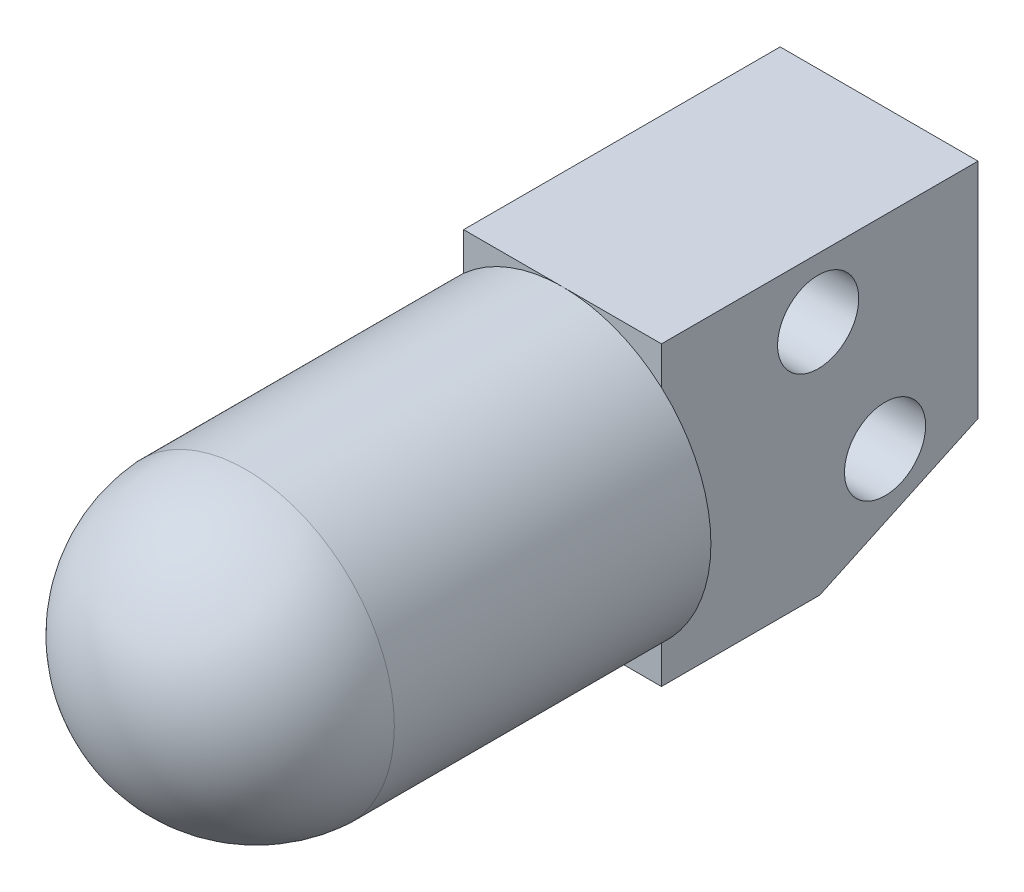
ISO-10303-21;
HEADER;
FILE_DESCRIPTION(('STEP AP214'),'2;1');
FILE_NAME('part.step','',(''),(''),'','','');
FILE_SCHEMA(('AUTOMOTIVE_DESIGN { 1 0 10303 214 1 1 1 1 }'));
ENDSEC;
DATA;
#1=APPLICATION_CONTEXT('core data for automotive mechanical design processes');
#2=APPLICATION_PROTOCOL_DEFINITION('international standard','automotive_design',2000,#1);
#3=PRODUCT_CONTEXT('',#1,'mechanical');
#4=PRODUCT('Part','Part','',(#3));
#5=PRODUCT_RELATED_PRODUCT_CATEGORY('part','',(#4));
#6=PRODUCT_DEFINITION_FORMATION('','',#4);
#7=PRODUCT_DEFINITION_CONTEXT('part definition',#1,'design');
#8=PRODUCT_DEFINITION('design','',#6,#7);
#9=PRODUCT_DEFINITION_SHAPE('','',#8);
#10=(LENGTH_UNIT() NAMED_UNIT(*) SI_UNIT(.MILLI.,.METRE.));
#11=(NAMED_UNIT(*) PLANE_ANGLE_UNIT() SI_UNIT($,.RADIAN.));
#12=(NAMED_UNIT(*) SI_UNIT($,.STERADIAN.) SOLID_ANGLE_UNIT());
#13=UNCERTAINTY_MEASURE_WITH_UNIT(LENGTH_MEASURE(1.E-05),#10,'distance_accuracy_value','');
#14=(GEOMETRIC_REPRESENTATION_CONTEXT(3) GLOBAL_UNCERTAINTY_ASSIGNED_CONTEXT((#13)) GLOBAL_UNIT_ASSIGNED_CONTEXT((#10,
#11,#12)) REPRESENTATION_CONTEXT('',''));
#15=CARTESIAN_POINT('',(0.,0.,0.));
#16=DIRECTION('',(0.,0.,1.));
#17=DIRECTION('',(1.,0.,0.));
#18=AXIS2_PLACEMENT_3D('',#15,#16,#17);
#19=CARTESIAN_POINT('',(0.,0.,0.));
#20=DIRECTION('',(0.,0.,1.));
#21=DIRECTION('',(1.,0.,0.));
#22=AXIS2_PLACEMENT_3D('',#19,#20,#21);
#23=PLANE('',#22);
#24=DIRECTION('',(0.,1.,0.));
#25=VECTOR('',#24,1.);
#26=CARTESIAN_POINT('',(-5.,-7.5,0.));
#27=LINE('',#26,#25);
#28=CARTESIAN_POINT('',(-5.,-5.59016994374947,0.));
#29=VERTEX_POINT('',#28);
#30=CARTESIAN_POINT('',(-5.,5.59016994374947,0.));
#31=VERTEX_POINT('',#30);
#32=EDGE_CURVE('E151',#29,#31,#27,.T.);
#33=ORIENTED_EDGE('',*,*,#32,.F.);
#34=CARTESIAN_POINT('',(0.,0.,0.));
#35=DIRECTION('',(0.,0.,1.));
#36=DIRECTION('',(1.,0.,0.));
#37=AXIS2_PLACEMENT_3D('',#34,#35,#36);
#38=CIRCLE('',#37,7.5);
#39=EDGE_CURVE('E197',#31,#29,#38,.T.);
#40=ORIENTED_EDGE('',*,*,#39,.F.);
#41=EDGE_LOOP('',(#33,#40));
#42=FACE_BOUND('',#41,.T.);
#43=ADVANCED_FACE('F43',(#42),#23,.F.);
#44=DIRECTION('',(0.,-1.,0.));
#45=VECTOR('',#44,1.);
#46=CARTESIAN_POINT('',(5.,-7.5,0.));
#47=LINE('',#46,#45);
#48=CARTESIAN_POINT('',(5.,5.59016994374948,0.));
#49=VERTEX_POINT('',#48);
#50=CARTESIAN_POINT('',(5.,-5.59016994374948,0.));
#51=VERTEX_POINT('',#50);
#52=EDGE_CURVE('E149',#49,#51,#47,.T.);
#53=ORIENTED_EDGE('',*,*,#52,.F.);
#54=EDGE_CURVE('E135',#51,#49,#38,.T.);
#55=ORIENTED_EDGE('',*,*,#54,.F.);
#56=EDGE_LOOP('',(#53,#55));
#57=FACE_BOUND('',#56,.T.);
#58=ADVANCED_FACE('F206',(#57),#23,.F.);
#59=CARTESIAN_POINT('',(0.,0.,16.));
#60=DIRECTION('',(0.,0.,-1.));
#61=DIRECTION('',(-1.,0.,0.));
#62=AXIS2_PLACEMENT_3D('',#59,#60,#61);
#63=CYLINDRICAL_SURFACE('',#62,7.5);
#64=CARTESIAN_POINT('',(0.,0.,16.));
#65=DIRECTION('',(0.,0.,1.));
#66=DIRECTION('',(1.,0.,0.));
#67=AXIS2_PLACEMENT_3D('',#64,#65,#66);
#68=CIRCLE('',#67,7.5);
#69=CARTESIAN_POINT('',(7.5,0.,16.));
#70=VERTEX_POINT('',#69);
#71=EDGE_CURVE('E145',#70,#70,#68,.T.);
#72=ORIENTED_EDGE('',*,*,#71,.F.);
#73=EDGE_LOOP('',(#72));
#74=FACE_BOUND('',#73,.T.);
#75=CARTESIAN_POINT('',(0.,7.5,0.));
#76=VERTEX_POINT('',#75);
#77=EDGE_CURVE('E140',#49,#76,#38,.T.);
#78=ORIENTED_EDGE('',*,*,#77,.T.);
#79=EDGE_CURVE('E146',#76,#31,#38,.T.);
#80=ORIENTED_EDGE('',*,*,#79,.T.);
#81=ORIENTED_EDGE('',*,*,#39,.T.);
#82=CARTESIAN_POINT('',(0.,-7.5,0.));
#83=VERTEX_POINT('',#82);
#84=EDGE_CURVE('E198',#29,#83,#38,.T.);
#85=ORIENTED_EDGE('',*,*,#84,.T.);
#86=EDGE_CURVE('E138',#83,#51,#38,.T.);
#87=ORIENTED_EDGE('',*,*,#86,.T.);
#88=ORIENTED_EDGE('',*,*,#54,.T.);
#89=EDGE_LOOP('',(#78,#80,#81,#85,#87,#88));
#90=FACE_BOUND('',#89,.T.);
#91=ADVANCED_FACE('F192',(#74,#90),#63,.T.);
#92=CARTESIAN_POINT('',(0.,0.,15.4821428571429));
#93=DIRECTION('',(0.,0.,1.));
#94=DIRECTION('',(1.,0.,0.));
#95=AXIS2_PLACEMENT_3D('',#92,#93,#94);
#96=SPHERICAL_SURFACE('',#95,7.51785714285714);
#97=ORIENTED_EDGE('',*,*,#71,.T.);
#98=EDGE_LOOP('',(#97));
#99=FACE_BOUND('',#98,.T.);
#100=ADVANCED_FACE('F231',(#99),#96,.T.);
#101=CARTESIAN_POINT('',(0.,0.,0.));
#102=DIRECTION('',(0.,0.,1.));
#103=DIRECTION('',(1.,0.,0.));
#104=AXIS2_PLACEMENT_3D('',#101,#102,#103);
#105=PLANE('',#104);
#106=ORIENTED_EDGE('',*,*,#77,.F.);
#107=CARTESIAN_POINT('',(5.,7.5,0.));
#108=VERTEX_POINT('',#107);
#109=EDGE_CURVE('E157',#108,#49,#47,.T.);
#110=ORIENTED_EDGE('',*,*,#109,.F.);
#111=DIRECTION('',(1.,0.,0.));
#112=VECTOR('',#111,1.);
#113=CARTESIAN_POINT('',(5.,7.5,0.));
#114=LINE('',#113,#112);
#115=EDGE_CURVE('E161',#76,#108,#114,.T.);
#116=ORIENTED_EDGE('',*,*,#115,.F.);
#117=EDGE_LOOP('',(#106,#110,#116));
#118=FACE_BOUND('',#117,.T.);
#119=ADVANCED_FACE('F188',(#118),#105,.T.);
#120=ORIENTED_EDGE('',*,*,#79,.F.);
#121=CARTESIAN_POINT('',(-5.,7.5,0.));
#122=VERTEX_POINT('',#121);
#123=EDGE_CURVE('E180',#122,#76,#114,.T.);
#124=ORIENTED_EDGE('',*,*,#123,.F.);
#125=EDGE_CURVE('E132',#31,#122,#27,.T.);
#126=ORIENTED_EDGE('',*,*,#125,.F.);
#127=EDGE_LOOP('',(#120,#124,#126));
#128=FACE_BOUND('',#127,.T.);
#129=ADVANCED_FACE('F196',(#128),#105,.T.);
#130=ORIENTED_EDGE('',*,*,#84,.F.);
#131=CARTESIAN_POINT('',(-5.,-7.5,0.));
#132=VERTEX_POINT('',#131);
#133=EDGE_CURVE('E153',#132,#29,#27,.T.);
#134=ORIENTED_EDGE('',*,*,#133,.F.);
#135=DIRECTION('',(-1.,0.,0.));
#136=VECTOR('',#135,1.);
#137=CARTESIAN_POINT('',(5.,-7.5,0.));
#138=LINE('',#137,#136);
#139=EDGE_CURVE('E178',#83,#132,#138,.T.);
#140=ORIENTED_EDGE('',*,*,#139,.F.);
#141=EDGE_LOOP('',(#130,#134,#140));
#142=FACE_BOUND('',#141,.T.);
#143=ADVANCED_FACE('F243',(#142),#105,.T.);
#144=ORIENTED_EDGE('',*,*,#86,.F.);
#145=CARTESIAN_POINT('',(5.,-7.5,0.));
#146=VERTEX_POINT('',#145);
#147=EDGE_CURVE('E116',#146,#83,#138,.T.);
#148=ORIENTED_EDGE('',*,*,#147,.F.);
#149=EDGE_CURVE('E158',#51,#146,#47,.T.);
#150=ORIENTED_EDGE('',*,*,#149,.F.);
#151=EDGE_LOOP('',(#144,#148,#150));
#152=FACE_BOUND('',#151,.T.);
#153=ADVANCED_FACE('F207',(#152),#105,.T.);
#154=CARTESIAN_POINT('',(-5.,-7.5,-16.));
#155=DIRECTION('',(1.,0.,0.));
#156=DIRECTION('',(0.,0.,-1.));
#157=AXIS2_PLACEMENT_3D('',#154,#155,#156);
#158=PLANE('',#157);
#159=CARTESIAN_POINT('',(-5.,4.5,-7.92119769695235));
#160=DIRECTION('',(1.,0.,0.));
#161=DIRECTION('',(0.,0.,-1.));
#162=AXIS2_PLACEMENT_3D('',#159,#160,#161);
#163=CIRCLE('',#162,2.05);
#164=CARTESIAN_POINT('',(-5.,4.5,-9.97119769695235));
#165=VERTEX_POINT('',#164);
#166=EDGE_CURVE('E170',#165,#165,#163,.T.);
#167=ORIENTED_EDGE('',*,*,#166,.T.);
#168=EDGE_LOOP('',(#167));
#169=FACE_BOUND('',#168,.T.);
#170=CARTESIAN_POINT('',(-5.,-2.75046229629318,-11.302143790878));
#171=DIRECTION('',(1.,0.,0.));
#172=DIRECTION('',(0.,0.,-1.));
#173=AXIS2_PLACEMENT_3D('',#170,#171,#172);
#174=CIRCLE('',#173,2.05);
#175=CARTESIAN_POINT('',(-5.,-2.75046229629318,-13.352143790878));
#176=VERTEX_POINT('',#175);
#177=EDGE_CURVE('E162',#176,#176,#174,.T.);
#178=ORIENTED_EDGE('',*,*,#177,.T.);
#179=EDGE_LOOP('',(#178));
#180=FACE_BOUND('',#179,.T.);
#181=DIRECTION('',(0.,1.,0.));
#182=VECTOR('',#181,1.);
#183=CARTESIAN_POINT('',(-5.,-7.5,-16.));
#184=LINE('',#183,#182);
#185=CARTESIAN_POINT('',(-5.,-3.76953873476001,-16.));
#186=VERTEX_POINT('',#185);
#187=CARTESIAN_POINT('',(-5.,7.5,-16.));
#188=VERTEX_POINT('',#187);
#189=EDGE_CURVE('E106',#186,#188,#184,.T.);
#190=ORIENTED_EDGE('',*,*,#189,.F.);
#191=DIRECTION('',(0.,0.422618261740698,-0.906307787036651));
#192=VECTOR('',#191,1.);
#193=CARTESIAN_POINT('',(-5.,-3.76953873476,-16.));
#194=LINE('',#193,#192);
#195=CARTESIAN_POINT('',(-5.,-7.5,-7.99999999999994));
#196=VERTEX_POINT('',#195);
#197=EDGE_CURVE('E65',#186,#196,#194,.F.);
#198=ORIENTED_EDGE('',*,*,#197,.T.);
#199=DIRECTION('',(0.,0.,1.));
#200=VECTOR('',#199,1.);
#201=CARTESIAN_POINT('',(-5.,-7.5,-16.));
#202=LINE('',#201,#200);
#203=EDGE_CURVE('E173',#196,#132,#202,.T.);
#204=ORIENTED_EDGE('',*,*,#203,.T.);
#205=ORIENTED_EDGE('',*,*,#133,.T.);
#206=ORIENTED_EDGE('',*,*,#32,.T.);
#207=ORIENTED_EDGE('',*,*,#125,.T.);
#208=DIRECTION('',(0.,0.,1.));
#209=VECTOR('',#208,1.);
#210=CARTESIAN_POINT('',(-5.,7.5,-16.));
#211=LINE('',#210,#209);
#212=EDGE_CURVE('E122',#188,#122,#211,.T.);
#213=ORIENTED_EDGE('',*,*,#212,.F.);
#214=EDGE_LOOP('',(#190,#198,#204,#205,#206,#207,#213));
#215=FACE_BOUND('',#214,.T.);
#216=ADVANCED_FACE('F129',(#169,#180,#215),#158,.F.);
#217=CARTESIAN_POINT('',(5.,7.5,-16.));
#218=DIRECTION('',(0.,-1.,0.));
#219=DIRECTION('',(0.,0.,-1.));
#220=AXIS2_PLACEMENT_3D('',#217,#218,#219);
#221=PLANE('',#220);
#222=ORIENTED_EDGE('',*,*,#123,.T.);
#223=ORIENTED_EDGE('',*,*,#115,.T.);
#224=DIRECTION('',(0.,0.,1.));
#225=VECTOR('',#224,1.);
#226=CARTESIAN_POINT('',(5.,7.5,-16.));
#227=LINE('',#226,#225);
#228=CARTESIAN_POINT('',(5.,7.5,-16.));
#229=VERTEX_POINT('',#228);
#230=EDGE_CURVE('E124',#229,#108,#227,.T.);
#231=ORIENTED_EDGE('',*,*,#230,.F.);
#232=DIRECTION('',(1.,0.,0.));
#233=VECTOR('',#232,1.);
#234=CARTESIAN_POINT('',(5.,7.5,-16.));
#235=LINE('',#234,#233);
#236=EDGE_CURVE('E110',#188,#229,#235,.T.);
#237=ORIENTED_EDGE('',*,*,#236,.F.);
#238=ORIENTED_EDGE('',*,*,#212,.T.);
#239=EDGE_LOOP('',(#222,#223,#231,#237,#238));
#240=FACE_BOUND('',#239,.T.);
#241=ADVANCED_FACE('F121',(#240),#221,.F.);
#242=CARTESIAN_POINT('',(5.,-7.5,-16.));
#243=DIRECTION('',(-1.,0.,0.));
#244=DIRECTION('',(0.,0.,1.));
#245=AXIS2_PLACEMENT_3D('',#242,#243,#244);
#246=PLANE('',#245);
#247=CARTESIAN_POINT('',(5.,4.5,-7.92119769695235));
#248=DIRECTION('',(1.,0.,0.));
#249=DIRECTION('',(0.,0.,-1.));
#250=AXIS2_PLACEMENT_3D('',#247,#248,#249);
#251=CIRCLE('',#250,2.05);
#252=CARTESIAN_POINT('',(5.,4.5,-9.97119769695235));
#253=VERTEX_POINT('',#252);
#254=EDGE_CURVE('E317',#253,#253,#251,.T.);
#255=ORIENTED_EDGE('',*,*,#254,.F.);
#256=EDGE_LOOP('',(#255));
#257=FACE_BOUND('',#256,.T.);
#258=CARTESIAN_POINT('',(5.,-2.75046229629318,-11.302143790878));
#259=DIRECTION('',(1.,0.,0.));
#260=DIRECTION('',(0.,0.,-1.));
#261=AXIS2_PLACEMENT_3D('',#258,#259,#260);
#262=CIRCLE('',#261,2.05);
#263=CARTESIAN_POINT('',(5.,-2.75046229629318,-13.352143790878));
#264=VERTEX_POINT('',#263);
#265=EDGE_CURVE('E165',#264,#264,#262,.T.);
#266=ORIENTED_EDGE('',*,*,#265,.F.);
#267=EDGE_LOOP('',(#266));
#268=FACE_BOUND('',#267,.T.);
#269=DIRECTION('',(0.,0.,1.));
#270=VECTOR('',#269,1.);
#271=CARTESIAN_POINT('',(5.,-7.5,-16.));
#272=LINE('',#271,#270);
#273=CARTESIAN_POINT('',(5.,-7.5,-7.99999999999994));
#274=VERTEX_POINT('',#273);
#275=EDGE_CURVE('E141',#274,#146,#272,.T.);
#276=ORIENTED_EDGE('',*,*,#275,.F.);
#277=DIRECTION('',(0.,-0.422618261740698,0.906307787036651));
#278=VECTOR('',#277,1.);
#279=CARTESIAN_POINT('',(5.,-3.76953873476,-16.));
#280=LINE('',#279,#278);
#281=CARTESIAN_POINT('',(5.,-3.76953873476001,-16.));
#282=VERTEX_POINT('',#281);
#283=EDGE_CURVE('E11',#274,#282,#280,.F.);
#284=ORIENTED_EDGE('',*,*,#283,.T.);
#285=DIRECTION('',(0.,-1.,0.));
#286=VECTOR('',#285,1.);
#287=CARTESIAN_POINT('',(5.,-7.5,-16.));
#288=LINE('',#287,#286);
#289=EDGE_CURVE('E127',#229,#282,#288,.T.);
#290=ORIENTED_EDGE('',*,*,#289,.F.);
#291=ORIENTED_EDGE('',*,*,#230,.T.);
#292=ORIENTED_EDGE('',*,*,#109,.T.);
#293=ORIENTED_EDGE('',*,*,#52,.T.);
#294=ORIENTED_EDGE('',*,*,#149,.T.);
#295=EDGE_LOOP('',(#276,#284,#290,#291,#292,#293,#294));
#296=FACE_BOUND('',#295,.T.);
#297=ADVANCED_FACE('F187',(#257,#268,#296),#246,.F.);
#298=CARTESIAN_POINT('',(5.,-7.5,-16.));
#299=DIRECTION('',(0.,1.,0.));
#300=DIRECTION('',(0.,0.,1.));
#301=AXIS2_PLACEMENT_3D('',#298,#299,#300);
#302=PLANE('',#301);
#303=ORIENTED_EDGE('',*,*,#203,.F.);
#304=DIRECTION('',(1.,0.,0.));
#305=VECTOR('',#304,1.);
#306=CARTESIAN_POINT('',(5.,-7.5,-7.99999999999994));
#307=LINE('',#306,#305);
#308=EDGE_CURVE('E51',#196,#274,#307,.T.);
#309=ORIENTED_EDGE('',*,*,#308,.T.);
#310=ORIENTED_EDGE('',*,*,#275,.T.);
#311=ORIENTED_EDGE('',*,*,#147,.T.);
#312=ORIENTED_EDGE('',*,*,#139,.T.);
#313=EDGE_LOOP('',(#303,#309,#310,#311,#312));
#314=FACE_BOUND('',#313,.T.);
#315=ADVANCED_FACE('F219',(#314),#302,.F.);
#316=CARTESIAN_POINT('',(0.,0.,-16.));
#317=DIRECTION('',(0.,0.,1.));
#318=DIRECTION('',(1.,0.,0.));
#319=AXIS2_PLACEMENT_3D('',#316,#317,#318);
#320=PLANE('',#319);
#321=ORIENTED_EDGE('',*,*,#289,.T.);
#322=DIRECTION('',(-1.,0.,0.));
#323=VECTOR('',#322,1.);
#324=CARTESIAN_POINT('',(0.,-3.76953873476,-16.));
#325=LINE('',#324,#323);
#326=EDGE_CURVE('E113',#282,#186,#325,.T.);
#327=ORIENTED_EDGE('',*,*,#326,.T.);
#328=ORIENTED_EDGE('',*,*,#189,.T.);
#329=ORIENTED_EDGE('',*,*,#236,.T.);
#330=EDGE_LOOP('',(#321,#327,#328,#329));
#331=FACE_BOUND('',#330,.T.);
#332=ADVANCED_FACE('F109',(#331),#320,.F.);
#333=CARTESIAN_POINT('',(0.,-3.76953873476,-16.));
#334=DIRECTION('',(0.,0.906307787036651,0.422618261740697));
#335=DIRECTION('',(-1.,0.,0.));
#336=AXIS2_PLACEMENT_3D('',#333,#334,#335);
#337=PLANE('',#336);
#338=ORIENTED_EDGE('',*,*,#283,.F.);
#339=ORIENTED_EDGE('',*,*,#308,.F.);
#340=ORIENTED_EDGE('',*,*,#197,.F.);
#341=ORIENTED_EDGE('',*,*,#326,.F.);
#342=EDGE_LOOP('',(#338,#339,#340,#341));
#343=FACE_BOUND('',#342,.T.);
#344=ADVANCED_FACE('F45',(#343),#337,.F.);
#345=CARTESIAN_POINT('',(5.,-2.75046229629318,-11.302143790878));
#346=DIRECTION('',(1.,0.,0.));
#347=DIRECTION('',(0.,0.,-1.));
#348=AXIS2_PLACEMENT_3D('',#345,#346,#347);
#349=CYLINDRICAL_SURFACE('',#348,2.05);
#350=ORIENTED_EDGE('',*,*,#177,.F.);
#351=EDGE_LOOP('',(#350));
#352=FACE_BOUND('',#351,.T.);
#353=ORIENTED_EDGE('',*,*,#265,.T.);
#354=EDGE_LOOP('',(#353));
#355=FACE_BOUND('',#354,.T.);
#356=ADVANCED_FACE('F211',(#352,#355),#349,.F.);
#357=CARTESIAN_POINT('',(5.,4.5,-7.92119769695235));
#358=DIRECTION('',(1.,0.,0.));
#359=DIRECTION('',(0.,0.,-1.));
#360=AXIS2_PLACEMENT_3D('',#357,#358,#359);
#361=CYLINDRICAL_SURFACE('',#360,2.05);
#362=ORIENTED_EDGE('',*,*,#166,.F.);
#363=EDGE_LOOP('',(#362));
#364=FACE_BOUND('',#363,.T.);
#365=ORIENTED_EDGE('',*,*,#254,.T.);
#366=EDGE_LOOP('',(#365));
#367=FACE_BOUND('',#366,.T.);
#368=ADVANCED_FACE('F216',(#364,#367),#361,.F.);
#369=CLOSED_SHELL('',(#43,#58,#91,#100,#119,#129,#143,#153,#216,#241,#297,#315,#332,#344,#356,#368));
#370=MANIFOLD_SOLID_BREP('B2',#369);
#371=ADVANCED_BREP_SHAPE_REPRESENTATION('',(#18,#370),#14);
#372=SHAPE_DEFINITION_REPRESENTATION(#9,#371);
ENDSEC;
END-ISO-10303-21;
